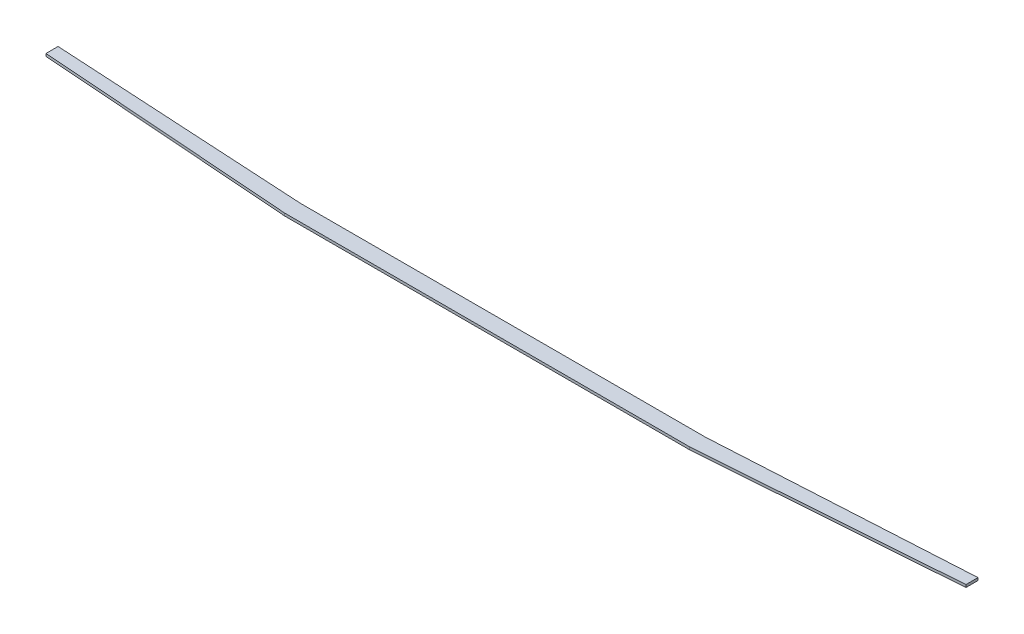
ISO-10303-21;
HEADER;
FILE_DESCRIPTION(('STEP AP214'),'2;1');
FILE_NAME('part.step','',(''),(''),'','','');
FILE_SCHEMA(('AUTOMOTIVE_DESIGN { 1 0 10303 214 1 1 1 1 }'));
ENDSEC;
DATA;
#1=APPLICATION_CONTEXT('core data for automotive mechanical design processes');
#2=APPLICATION_PROTOCOL_DEFINITION('international standard','automotive_design',2000,#1);
#3=PRODUCT_CONTEXT('',#1,'mechanical');
#4=PRODUCT('Part','Part','',(#3));
#5=PRODUCT_RELATED_PRODUCT_CATEGORY('part','',(#4));
#6=PRODUCT_DEFINITION_FORMATION('','',#4);
#7=PRODUCT_DEFINITION_CONTEXT('part definition',#1,'design');
#8=PRODUCT_DEFINITION('design','',#6,#7);
#9=PRODUCT_DEFINITION_SHAPE('','',#8);
#10=(LENGTH_UNIT() NAMED_UNIT(*) SI_UNIT(.MILLI.,.METRE.));
#11=(NAMED_UNIT(*) PLANE_ANGLE_UNIT() SI_UNIT($,.RADIAN.));
#12=(NAMED_UNIT(*) SI_UNIT($,.STERADIAN.) SOLID_ANGLE_UNIT());
#13=UNCERTAINTY_MEASURE_WITH_UNIT(LENGTH_MEASURE(1.E-05),#10,'distance_accuracy_value','');
#14=(GEOMETRIC_REPRESENTATION_CONTEXT(3) GLOBAL_UNCERTAINTY_ASSIGNED_CONTEXT((#13)) GLOBAL_UNIT_ASSIGNED_CONTEXT((#10,
#11,#12)) REPRESENTATION_CONTEXT('',''));
#15=CARTESIAN_POINT('',(0.,0.,0.));
#16=DIRECTION('',(0.,0.,1.));
#17=DIRECTION('',(1.,0.,0.));
#18=AXIS2_PLACEMENT_3D('',#15,#16,#17);
#19=CARTESIAN_POINT('',(0.,4.3,13.5));
#20=DIRECTION('',(0.,0.,-1.));
#21=DIRECTION('',(-1.,0.,0.));
#22=AXIS2_PLACEMENT_3D('',#19,#20,#21);
#23=PLANE('',#22);
#24=DIRECTION('',(1.,0.,0.));
#25=VECTOR('',#24,1.);
#26=CARTESIAN_POINT('',(0.,0.,13.5));
#27=LINE('',#26,#25);
#28=CARTESIAN_POINT('',(-335.3,0.,13.5));
#29=VERTEX_POINT('',#28);
#30=CARTESIAN_POINT('',(335.3,0.,13.5));
#31=VERTEX_POINT('',#30);
#32=EDGE_CURVE('E132',#29,#31,#27,.T.);
#33=ORIENTED_EDGE('',*,*,#32,.T.);
#34=DIRECTION('',(0.,-1.,0.));
#35=VECTOR('',#34,1.);
#36=CARTESIAN_POINT('',(335.3,4.3,13.5));
#37=LINE('',#36,#35);
#38=CARTESIAN_POINT('',(335.3,4.3,13.5));
#39=VERTEX_POINT('',#38);
#40=EDGE_CURVE('E11',#39,#31,#37,.T.);
#41=ORIENTED_EDGE('',*,*,#40,.F.);
#42=DIRECTION('',(1.,0.,0.));
#43=VECTOR('',#42,1.);
#44=CARTESIAN_POINT('',(0.,4.3,13.5));
#45=LINE('',#44,#43);
#46=CARTESIAN_POINT('',(-335.3,4.3,13.5));
#47=VERTEX_POINT('',#46);
#48=EDGE_CURVE('E87',#47,#39,#45,.T.);
#49=ORIENTED_EDGE('',*,*,#48,.F.);
#50=DIRECTION('',(0.,-1.,0.));
#51=VECTOR('',#50,1.);
#52=CARTESIAN_POINT('',(-335.3,4.3,13.5));
#53=LINE('',#52,#51);
#54=EDGE_CURVE('E151',#47,#29,#53,.T.);
#55=ORIENTED_EDGE('',*,*,#54,.T.);
#56=EDGE_LOOP('',(#33,#41,#49,#55));
#57=FACE_BOUND('',#56,.T.);
#58=ADVANCED_FACE('F39',(#57),#23,.F.);
#59=CARTESIAN_POINT('',(335.3,4.3,13.5));
#60=DIRECTION('',(-0.0731570880358106,0.,-0.997320430187871));
#61=DIRECTION('',(-0.997320430187871,0.,0.0731570880358106));
#62=AXIS2_PLACEMENT_3D('',#59,#60,#61);
#63=PLANE('',#62);
#64=DIRECTION('',(0.997320430187871,0.,-0.0731570880358106));
#65=VECTOR('',#64,1.);
#66=CARTESIAN_POINT('',(335.3,0.,13.5));
#67=LINE('',#66,#65);
#68=CARTESIAN_POINT('',(762.,0.,-17.8));
#69=VERTEX_POINT('',#68);
#70=EDGE_CURVE('E178',#31,#69,#67,.T.);
#71=ORIENTED_EDGE('',*,*,#70,.T.);
#72=DIRECTION('',(0.,-1.,0.));
#73=VECTOR('',#72,1.);
#74=CARTESIAN_POINT('',(762.,4.3,-17.8));
#75=LINE('',#74,#73);
#76=CARTESIAN_POINT('',(762.,4.3,-17.8));
#77=VERTEX_POINT('',#76);
#78=EDGE_CURVE('E48',#77,#69,#75,.T.);
#79=ORIENTED_EDGE('',*,*,#78,.F.);
#80=DIRECTION('',(0.997320430187871,0.,-0.0731570880358106));
#81=VECTOR('',#80,1.);
#82=CARTESIAN_POINT('',(335.3,4.3,13.5));
#83=LINE('',#82,#81);
#84=EDGE_CURVE('E168',#39,#77,#83,.T.);
#85=ORIENTED_EDGE('',*,*,#84,.F.);
#86=ORIENTED_EDGE('',*,*,#40,.T.);
#87=EDGE_LOOP('',(#71,#79,#85,#86));
#88=FACE_BOUND('',#87,.T.);
#89=ADVANCED_FACE('F208',(#88),#63,.F.);
#90=CARTESIAN_POINT('',(762.,4.3,-17.8));
#91=DIRECTION('',(-1.,0.,0.));
#92=DIRECTION('',(0.,0.,1.));
#93=AXIS2_PLACEMENT_3D('',#90,#91,#92);
#94=PLANE('',#93);
#95=DIRECTION('',(0.,0.,-1.));
#96=VECTOR('',#95,1.);
#97=CARTESIAN_POINT('',(762.,0.,-17.8));
#98=LINE('',#97,#96);
#99=CARTESIAN_POINT('',(762.,0.,-37.8));
#100=VERTEX_POINT('',#99);
#101=EDGE_CURVE('E74',#69,#100,#98,.T.);
#102=ORIENTED_EDGE('',*,*,#101,.T.);
#103=DIRECTION('',(0.,-1.,0.));
#104=VECTOR('',#103,1.);
#105=CARTESIAN_POINT('',(762.,4.3,-37.8));
#106=LINE('',#105,#104);
#107=CARTESIAN_POINT('',(762.,4.3,-37.8));
#108=VERTEX_POINT('',#107);
#109=EDGE_CURVE('E189',#108,#100,#106,.T.);
#110=ORIENTED_EDGE('',*,*,#109,.F.);
#111=DIRECTION('',(0.,0.,-1.));
#112=VECTOR('',#111,1.);
#113=CARTESIAN_POINT('',(762.,4.3,-17.8));
#114=LINE('',#113,#112);
#115=EDGE_CURVE('E171',#77,#108,#114,.T.);
#116=ORIENTED_EDGE('',*,*,#115,.F.);
#117=ORIENTED_EDGE('',*,*,#78,.T.);
#118=EDGE_LOOP('',(#102,#110,#116,#117));
#119=FACE_BOUND('',#118,.T.);
#120=ADVANCED_FACE('F194',(#119),#94,.F.);
#121=CARTESIAN_POINT('',(762.,4.3,-37.8));
#122=DIRECTION('',(0.0568565533027877,0.,0.998382357790104));
#123=DIRECTION('',(0.998382357790104,0.,-0.0568565533027878));
#124=AXIS2_PLACEMENT_3D('',#121,#122,#123);
#125=PLANE('',#124);
#126=DIRECTION('',(-0.998382357790104,0.,0.0568565533027877));
#127=VECTOR('',#126,1.);
#128=CARTESIAN_POINT('',(762.,0.,-37.8));
#129=LINE('',#128,#127);
#130=CARTESIAN_POINT('',(335.3,0.,-13.5));
#131=VERTEX_POINT('',#130);
#132=EDGE_CURVE('E80',#100,#131,#129,.T.);
#133=ORIENTED_EDGE('',*,*,#132,.T.);
#134=DIRECTION('',(0.,-1.,0.));
#135=VECTOR('',#134,1.);
#136=CARTESIAN_POINT('',(335.3,4.3,-13.5));
#137=LINE('',#136,#135);
#138=CARTESIAN_POINT('',(335.3,4.3,-13.5));
#139=VERTEX_POINT('',#138);
#140=EDGE_CURVE('E121',#139,#131,#137,.T.);
#141=ORIENTED_EDGE('',*,*,#140,.F.);
#142=DIRECTION('',(-0.998382357790104,0.,0.0568565533027877));
#143=VECTOR('',#142,1.);
#144=CARTESIAN_POINT('',(762.,4.3,-37.8));
#145=LINE('',#144,#143);
#146=EDGE_CURVE('E56',#108,#139,#145,.T.);
#147=ORIENTED_EDGE('',*,*,#146,.F.);
#148=ORIENTED_EDGE('',*,*,#109,.T.);
#149=EDGE_LOOP('',(#133,#141,#147,#148));
#150=FACE_BOUND('',#149,.T.);
#151=ADVANCED_FACE('F209',(#150),#125,.F.);
#152=CARTESIAN_POINT('',(0.,4.3,-13.5));
#153=DIRECTION('',(0.,0.,1.));
#154=DIRECTION('',(1.,0.,0.));
#155=AXIS2_PLACEMENT_3D('',#152,#153,#154);
#156=PLANE('',#155);
#157=DIRECTION('',(-1.,0.,0.));
#158=VECTOR('',#157,1.);
#159=CARTESIAN_POINT('',(0.,0.,-13.5));
#160=LINE('',#159,#158);
#161=CARTESIAN_POINT('',(-335.3,0.,-13.5));
#162=VERTEX_POINT('',#161);
#163=EDGE_CURVE('E127',#131,#162,#160,.T.);
#164=ORIENTED_EDGE('',*,*,#163,.T.);
#165=DIRECTION('',(0.,-1.,0.));
#166=VECTOR('',#165,1.);
#167=CARTESIAN_POINT('',(-335.3,4.3,-13.5));
#168=LINE('',#167,#166);
#169=CARTESIAN_POINT('',(-335.3,4.3,-13.5));
#170=VERTEX_POINT('',#169);
#171=EDGE_CURVE('E124',#170,#162,#168,.T.);
#172=ORIENTED_EDGE('',*,*,#171,.F.);
#173=DIRECTION('',(-1.,0.,0.));
#174=VECTOR('',#173,1.);
#175=CARTESIAN_POINT('',(0.,4.3,-13.5));
#176=LINE('',#175,#174);
#177=EDGE_CURVE('E112',#139,#170,#176,.T.);
#178=ORIENTED_EDGE('',*,*,#177,.F.);
#179=ORIENTED_EDGE('',*,*,#140,.T.);
#180=EDGE_LOOP('',(#164,#172,#178,#179));
#181=FACE_BOUND('',#180,.T.);
#182=ADVANCED_FACE('F125',(#181),#156,.F.);
#183=CARTESIAN_POINT('',(0.,4.3,0.));
#184=DIRECTION('',(0.,1.,0.));
#185=DIRECTION('',(0.,0.,1.));
#186=AXIS2_PLACEMENT_3D('',#183,#184,#185);
#187=PLANE('',#186);
#188=ORIENTED_EDGE('',*,*,#177,.T.);
#189=DIRECTION('',(0.998382357790104,0.,0.0568565533027877));
#190=VECTOR('',#189,1.);
#191=CARTESIAN_POINT('',(-762.,4.3,-37.8));
#192=LINE('',#191,#190);
#193=CARTESIAN_POINT('',(-762.,4.3,-37.8));
#194=VERTEX_POINT('',#193);
#195=EDGE_CURVE('E117',#194,#170,#192,.T.);
#196=ORIENTED_EDGE('',*,*,#195,.F.);
#197=DIRECTION('',(0.,0.,-1.));
#198=VECTOR('',#197,1.);
#199=CARTESIAN_POINT('',(-762.,4.3,-17.8));
#200=LINE('',#199,#198);
#201=CARTESIAN_POINT('',(-762.,4.3,-17.8));
#202=VERTEX_POINT('',#201);
#203=EDGE_CURVE('E137',#202,#194,#200,.T.);
#204=ORIENTED_EDGE('',*,*,#203,.F.);
#205=DIRECTION('',(-0.997320430187871,0.,-0.0731570880358106));
#206=VECTOR('',#205,1.);
#207=CARTESIAN_POINT('',(-335.3,4.3,13.5));
#208=LINE('',#207,#206);
#209=EDGE_CURVE('E142',#47,#202,#208,.T.);
#210=ORIENTED_EDGE('',*,*,#209,.F.);
#211=ORIENTED_EDGE('',*,*,#48,.T.);
#212=ORIENTED_EDGE('',*,*,#84,.T.);
#213=ORIENTED_EDGE('',*,*,#115,.T.);
#214=ORIENTED_EDGE('',*,*,#146,.T.);
#215=EDGE_LOOP('',(#188,#196,#204,#210,#211,#212,#213,#214));
#216=FACE_BOUND('',#215,.T.);
#217=ADVANCED_FACE('F114',(#216),#187,.T.);
#218=CARTESIAN_POINT('',(0.,0.,0.));
#219=DIRECTION('',(0.,1.,0.));
#220=DIRECTION('',(0.,0.,1.));
#221=AXIS2_PLACEMENT_3D('',#218,#219,#220);
#222=PLANE('',#221);
#223=ORIENTED_EDGE('',*,*,#32,.F.);
#224=DIRECTION('',(-0.997320430187871,0.,-0.0731570880358106));
#225=VECTOR('',#224,1.);
#226=CARTESIAN_POINT('',(-335.3,0.,13.5));
#227=LINE('',#226,#225);
#228=CARTESIAN_POINT('',(-762.,0.,-17.8));
#229=VERTEX_POINT('',#228);
#230=EDGE_CURVE('E138',#29,#229,#227,.T.);
#231=ORIENTED_EDGE('',*,*,#230,.T.);
#232=DIRECTION('',(0.,0.,-1.));
#233=VECTOR('',#232,1.);
#234=CARTESIAN_POINT('',(-762.,0.,-17.8));
#235=LINE('',#234,#233);
#236=CARTESIAN_POINT('',(-762.,0.,-37.8));
#237=VERTEX_POINT('',#236);
#238=EDGE_CURVE('E145',#229,#237,#235,.T.);
#239=ORIENTED_EDGE('',*,*,#238,.T.);
#240=DIRECTION('',(0.998382357790104,0.,0.0568565533027877));
#241=VECTOR('',#240,1.);
#242=CARTESIAN_POINT('',(-762.,0.,-37.8));
#243=LINE('',#242,#241);
#244=EDGE_CURVE('E152',#237,#162,#243,.T.);
#245=ORIENTED_EDGE('',*,*,#244,.T.);
#246=ORIENTED_EDGE('',*,*,#163,.F.);
#247=ORIENTED_EDGE('',*,*,#132,.F.);
#248=ORIENTED_EDGE('',*,*,#101,.F.);
#249=ORIENTED_EDGE('',*,*,#70,.F.);
#250=EDGE_LOOP('',(#223,#231,#239,#245,#246,#247,#248,#249));
#251=FACE_BOUND('',#250,.T.);
#252=ADVANCED_FACE('F199',(#251),#222,.F.);
#253=CARTESIAN_POINT('',(-762.,4.3,-37.8));
#254=DIRECTION('',(0.0568565533027877,0.,-0.998382357790104));
#255=DIRECTION('',(-0.998382357790104,0.,-0.0568565533027878));
#256=AXIS2_PLACEMENT_3D('',#253,#254,#255);
#257=PLANE('',#256);
#258=ORIENTED_EDGE('',*,*,#244,.F.);
#259=DIRECTION('',(0.,-1.,0.));
#260=VECTOR('',#259,1.);
#261=CARTESIAN_POINT('',(-762.,4.3,-37.8));
#262=LINE('',#261,#260);
#263=EDGE_CURVE('E133',#194,#237,#262,.T.);
#264=ORIENTED_EDGE('',*,*,#263,.F.);
#265=ORIENTED_EDGE('',*,*,#195,.T.);
#266=ORIENTED_EDGE('',*,*,#171,.T.);
#267=EDGE_LOOP('',(#258,#264,#265,#266));
#268=FACE_BOUND('',#267,.T.);
#269=ADVANCED_FACE('F135',(#268),#257,.T.);
#270=CARTESIAN_POINT('',(-762.,4.3,-17.8));
#271=DIRECTION('',(-1.,0.,0.));
#272=DIRECTION('',(0.,0.,1.));
#273=AXIS2_PLACEMENT_3D('',#270,#271,#272);
#274=PLANE('',#273);
#275=ORIENTED_EDGE('',*,*,#238,.F.);
#276=DIRECTION('',(0.,-1.,0.));
#277=VECTOR('',#276,1.);
#278=CARTESIAN_POINT('',(-762.,4.3,-17.8));
#279=LINE('',#278,#277);
#280=EDGE_CURVE('E161',#202,#229,#279,.T.);
#281=ORIENTED_EDGE('',*,*,#280,.F.);
#282=ORIENTED_EDGE('',*,*,#203,.T.);
#283=ORIENTED_EDGE('',*,*,#263,.T.);
#284=EDGE_LOOP('',(#275,#281,#282,#283));
#285=FACE_BOUND('',#284,.T.);
#286=ADVANCED_FACE('F203',(#285),#274,.T.);
#287=CARTESIAN_POINT('',(-335.3,4.3,13.5));
#288=DIRECTION('',(-0.0731570880358106,0.,0.997320430187871));
#289=DIRECTION('',(0.997320430187871,0.,0.0731570880358106));
#290=AXIS2_PLACEMENT_3D('',#287,#288,#289);
#291=PLANE('',#290);
#292=ORIENTED_EDGE('',*,*,#230,.F.);
#293=ORIENTED_EDGE('',*,*,#54,.F.);
#294=ORIENTED_EDGE('',*,*,#209,.T.);
#295=ORIENTED_EDGE('',*,*,#280,.T.);
#296=EDGE_LOOP('',(#292,#293,#294,#295));
#297=FACE_BOUND('',#296,.T.);
#298=ADVANCED_FACE('F206',(#297),#291,.T.);
#299=CLOSED_SHELL('',(#58,#89,#120,#151,#182,#217,#252,#269,#286,#298));
#300=MANIFOLD_SOLID_BREP('B2',#299);
#301=ADVANCED_BREP_SHAPE_REPRESENTATION('',(#18,#300),#14);
#302=SHAPE_DEFINITION_REPRESENTATION(#9,#301);
ENDSEC;
END-ISO-10303-21;
